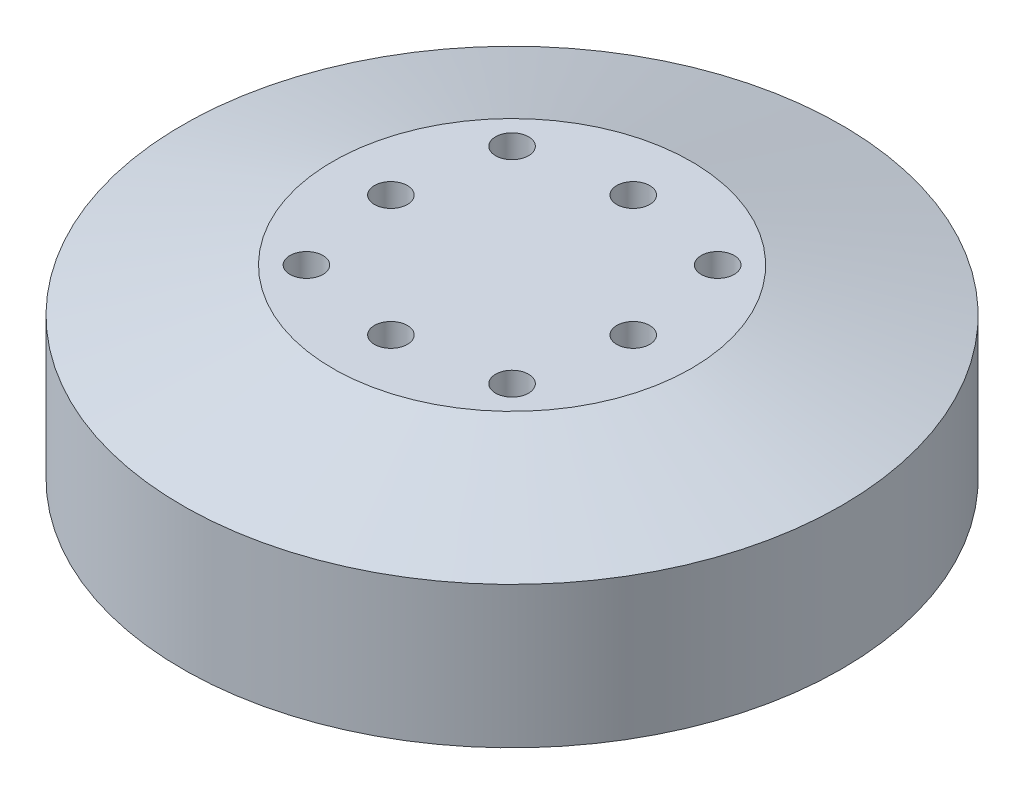
ISO-10303-21;
HEADER;
FILE_DESCRIPTION(('STEP AP214'),'2;1');
FILE_NAME('part.step','',(''),(''),'','','');
FILE_SCHEMA(('AUTOMOTIVE_DESIGN { 1 0 10303 214 1 1 1 1 }'));
ENDSEC;
DATA;
#1=APPLICATION_CONTEXT('core data for automotive mechanical design processes');
#2=APPLICATION_PROTOCOL_DEFINITION('international standard','automotive_design',2000,#1);
#3=PRODUCT_CONTEXT('',#1,'mechanical');
#4=PRODUCT('Part','Part','',(#3));
#5=PRODUCT_RELATED_PRODUCT_CATEGORY('part','',(#4));
#6=PRODUCT_DEFINITION_FORMATION('','',#4);
#7=PRODUCT_DEFINITION_CONTEXT('part definition',#1,'design');
#8=PRODUCT_DEFINITION('design','',#6,#7);
#9=PRODUCT_DEFINITION_SHAPE('','',#8);
#10=(LENGTH_UNIT() NAMED_UNIT(*) SI_UNIT(.MILLI.,.METRE.));
#11=(NAMED_UNIT(*) PLANE_ANGLE_UNIT() SI_UNIT($,.RADIAN.));
#12=(NAMED_UNIT(*) SI_UNIT($,.STERADIAN.) SOLID_ANGLE_UNIT());
#13=UNCERTAINTY_MEASURE_WITH_UNIT(LENGTH_MEASURE(1.E-05),#10,'distance_accuracy_value','');
#14=(GEOMETRIC_REPRESENTATION_CONTEXT(3) GLOBAL_UNCERTAINTY_ASSIGNED_CONTEXT((#13)) GLOBAL_UNIT_ASSIGNED_CONTEXT((#10,
#11,#12)) REPRESENTATION_CONTEXT('',''));
#15=CARTESIAN_POINT('',(0.,0.,0.));
#16=DIRECTION('',(0.,0.,1.));
#17=DIRECTION('',(1.,0.,0.));
#18=AXIS2_PLACEMENT_3D('',#15,#16,#17);
#19=CARTESIAN_POINT('',(0.,-9.55000000000001,0.));
#20=DIRECTION('',(0.,-1.,0.));
#21=DIRECTION('',(1.,0.,0.));
#22=AXIS2_PLACEMENT_3D('',#19,#20,#21);
#23=CYLINDRICAL_SURFACE('',#22,34.);
#24=CARTESIAN_POINT('',(0.,-9.55,0.));
#25=DIRECTION('',(0.,-1.,0.));
#26=DIRECTION('',(1.,0.,0.));
#27=AXIS2_PLACEMENT_3D('',#24,#25,#26);
#28=CIRCLE('',#27,34.);
#29=CARTESIAN_POINT('',(34.,-9.54999999999999,0.));
#30=VERTEX_POINT('',#29);
#31=EDGE_CURVE('E11',#30,#30,#28,.T.);
#32=ORIENTED_EDGE('',*,*,#31,.F.);
#33=EDGE_LOOP('',(#32));
#34=FACE_BOUND('',#33,.T.);
#35=CARTESIAN_POINT('',(0.,5.05000000000001,0.));
#36=DIRECTION('',(0.,-1.,0.));
#37=DIRECTION('',(1.,0.,0.));
#38=AXIS2_PLACEMENT_3D('',#35,#36,#37);
#39=CIRCLE('',#38,34.);
#40=CARTESIAN_POINT('',(34.,5.05000000000001,0.));
#41=VERTEX_POINT('',#40);
#42=EDGE_CURVE('E126',#41,#41,#39,.T.);
#43=ORIENTED_EDGE('',*,*,#42,.T.);
#44=EDGE_LOOP('',(#43));
#45=FACE_BOUND('',#44,.T.);
#46=ADVANCED_FACE('F35',(#34,#45),#23,.T.);
#47=CARTESIAN_POINT('',(-34.,-9.55000000000001,0.));
#48=DIRECTION('',(0.,1.,0.));
#49=DIRECTION('',(-1.,0.,0.));
#50=AXIS2_PLACEMENT_3D('',#47,#48,#49);
#51=PLANE('',#50);
#52=CARTESIAN_POINT('',(0.,-9.55,0.));
#53=DIRECTION('',(0.,-1.,0.));
#54=DIRECTION('',(1.,0.,0.));
#55=AXIS2_PLACEMENT_3D('',#52,#53,#54);
#56=CIRCLE('',#55,32.);
#57=CARTESIAN_POINT('',(32.,-9.55,0.));
#58=VERTEX_POINT('',#57);
#59=EDGE_CURVE('E381',#58,#58,#56,.T.);
#60=ORIENTED_EDGE('',*,*,#59,.F.);
#61=EDGE_LOOP('',(#60));
#62=FACE_BOUND('',#61,.T.);
#63=ORIENTED_EDGE('',*,*,#31,.T.);
#64=EDGE_LOOP('',(#63));
#65=FACE_BOUND('',#64,.T.);
#66=ADVANCED_FACE('F135',(#62,#65),#51,.F.);
#67=CARTESIAN_POINT('',(0.,9.55,0.));
#68=DIRECTION('',(0.,-1.,0.));
#69=DIRECTION('',(1.,0.,0.));
#70=AXIS2_PLACEMENT_3D('',#67,#68,#69);
#71=PLANE('',#70);
#72=CARTESIAN_POINT('',(-10.6066017177983,9.55,-10.6066017177982));
#73=DIRECTION('',(0.,1.,0.));
#74=DIRECTION('',(0.,0.,1.));
#75=AXIS2_PLACEMENT_3D('',#72,#73,#74);
#76=CIRCLE('',#75,1.69999999999999);
#77=CARTESIAN_POINT('',(-10.6066017177983,9.55,-8.90660171779816));
#78=VERTEX_POINT('',#77);
#79=EDGE_CURVE('E78',#78,#78,#76,.T.);
#80=ORIENTED_EDGE('',*,*,#79,.F.);
#81=EDGE_LOOP('',(#80));
#82=FACE_BOUND('',#81,.T.);
#83=CARTESIAN_POINT('',(0.,9.55000000000001,-12.5));
#84=DIRECTION('',(0.,1.,0.));
#85=DIRECTION('',(0.,0.,1.));
#86=AXIS2_PLACEMENT_3D('',#83,#84,#85);
#87=CIRCLE('',#86,1.69999999999999);
#88=CARTESIAN_POINT('',(0.,9.55000000000001,-10.8));
#89=VERTEX_POINT('',#88);
#90=EDGE_CURVE('E77',#89,#89,#87,.T.);
#91=ORIENTED_EDGE('',*,*,#90,.F.);
#92=EDGE_LOOP('',(#91));
#93=FACE_BOUND('',#92,.T.);
#94=CARTESIAN_POINT('',(10.6066017177982,9.55000000000001,-10.6066017177982));
#95=DIRECTION('',(0.,1.,0.));
#96=DIRECTION('',(0.,0.,1.));
#97=AXIS2_PLACEMENT_3D('',#94,#95,#96);
#98=CIRCLE('',#97,1.69999999999999);
#99=CARTESIAN_POINT('',(10.6066017177982,9.55000000000001,-8.90660171779824));
#100=VERTEX_POINT('',#99);
#101=EDGE_CURVE('E90',#100,#100,#98,.T.);
#102=ORIENTED_EDGE('',*,*,#101,.F.);
#103=EDGE_LOOP('',(#102));
#104=FACE_BOUND('',#103,.T.);
#105=CARTESIAN_POINT('',(12.5,9.55000000000001,0.));
#106=DIRECTION('',(0.,1.,0.));
#107=DIRECTION('',(0.,0.,1.));
#108=AXIS2_PLACEMENT_3D('',#105,#106,#107);
#109=CIRCLE('',#108,1.69999999999999);
#110=CARTESIAN_POINT('',(12.5,9.55000000000001,1.69999999999999));
#111=VERTEX_POINT('',#110);
#112=EDGE_CURVE('E96',#111,#111,#109,.T.);
#113=ORIENTED_EDGE('',*,*,#112,.F.);
#114=EDGE_LOOP('',(#113));
#115=FACE_BOUND('',#114,.T.);
#116=CARTESIAN_POINT('',(10.6066017177983,9.55000000000001,10.6066017177982));
#117=DIRECTION('',(0.,1.,0.));
#118=DIRECTION('',(0.,0.,1.));
#119=AXIS2_PLACEMENT_3D('',#116,#117,#118);
#120=CIRCLE('',#119,1.69999999999999);
#121=CARTESIAN_POINT('',(10.6066017177983,9.55000000000001,12.3066017177981));
#122=VERTEX_POINT('',#121);
#123=EDGE_CURVE('E102',#122,#122,#120,.T.);
#124=ORIENTED_EDGE('',*,*,#123,.F.);
#125=EDGE_LOOP('',(#124));
#126=FACE_BOUND('',#125,.T.);
#127=CARTESIAN_POINT('',(-10.6066017177982,9.55,10.6066017177982));
#128=DIRECTION('',(0.,1.,0.));
#129=DIRECTION('',(0.,0.,1.));
#130=AXIS2_PLACEMENT_3D('',#127,#128,#129);
#131=CIRCLE('',#130,1.69999999999999);
#132=CARTESIAN_POINT('',(-10.6066017177982,9.55,12.3066017177982));
#133=VERTEX_POINT('',#132);
#134=EDGE_CURVE('E108',#133,#133,#131,.T.);
#135=ORIENTED_EDGE('',*,*,#134,.F.);
#136=EDGE_LOOP('',(#135));
#137=FACE_BOUND('',#136,.T.);
#138=CARTESIAN_POINT('',(-12.5,9.55,0.));
#139=DIRECTION('',(0.,1.,0.));
#140=DIRECTION('',(0.,0.,1.));
#141=AXIS2_PLACEMENT_3D('',#138,#139,#140);
#142=CIRCLE('',#141,1.69999999999999);
#143=CARTESIAN_POINT('',(-12.5,9.55,1.69999999999999));
#144=VERTEX_POINT('',#143);
#145=EDGE_CURVE('E114',#144,#144,#142,.T.);
#146=ORIENTED_EDGE('',*,*,#145,.F.);
#147=EDGE_LOOP('',(#146));
#148=FACE_BOUND('',#147,.T.);
#149=CARTESIAN_POINT('',(0.,9.55000000000001,12.5));
#150=DIRECTION('',(0.,1.,0.));
#151=DIRECTION('',(0.,0.,1.));
#152=AXIS2_PLACEMENT_3D('',#149,#150,#151);
#153=CIRCLE('',#152,1.69999999999999);
#154=CARTESIAN_POINT('',(0.,9.55000000000001,14.2));
#155=VERTEX_POINT('',#154);
#156=EDGE_CURVE('E120',#155,#155,#153,.T.);
#157=ORIENTED_EDGE('',*,*,#156,.F.);
#158=EDGE_LOOP('',(#157));
#159=FACE_BOUND('',#158,.T.);
#160=CARTESIAN_POINT('',(0.,9.55,0.));
#161=DIRECTION('',(0.,-1.,0.));
#162=DIRECTION('',(1.,0.,0.));
#163=AXIS2_PLACEMENT_3D('',#160,#161,#162);
#164=CIRCLE('',#163,18.5);
#165=CARTESIAN_POINT('',(18.5,9.55,0.));
#166=VERTEX_POINT('',#165);
#167=EDGE_CURVE('E42',#166,#166,#164,.T.);
#168=ORIENTED_EDGE('',*,*,#167,.F.);
#169=EDGE_LOOP('',(#168));
#170=FACE_BOUND('',#169,.T.);
#171=ADVANCED_FACE('F133',(#82,#93,#104,#115,#126,#137,#148,#159,#170),#71,.F.);
#172=CARTESIAN_POINT('',(0.,9.55,0.));
#173=DIRECTION('',(0.,-1.,0.));
#174=DIRECTION('',(1.,0.,0.));
#175=AXIS2_PLACEMENT_3D('',#172,#173,#174);
#176=CONICAL_SURFACE('',#175,18.5,1.28824137432531);
#177=ORIENTED_EDGE('',*,*,#42,.F.);
#178=EDGE_LOOP('',(#177));
#179=FACE_BOUND('',#178,.T.);
#180=ORIENTED_EDGE('',*,*,#167,.T.);
#181=EDGE_LOOP('',(#180));
#182=FACE_BOUND('',#181,.T.);
#183=ADVANCED_FACE('F131',(#179,#182),#176,.T.);
#184=CARTESIAN_POINT('',(0.,5.55,12.5));
#185=DIRECTION('',(0.,1.,0.));
#186=DIRECTION('',(0.,0.,1.));
#187=AXIS2_PLACEMENT_3D('',#184,#185,#186);
#188=CONICAL_SURFACE('',#187,1.69999999999999,1.02974425867665);
#189=CARTESIAN_POINT('',(0.,4.52853694765315,12.5));
#190=VERTEX_POINT('',#189);
#191=VERTEX_LOOP('',#190);
#192=FACE_BOUND('',#191,.T.);
#193=CARTESIAN_POINT('',(0.,5.55,12.5));
#194=DIRECTION('',(0.,1.,0.));
#195=DIRECTION('',(0.,0.,1.));
#196=AXIS2_PLACEMENT_3D('',#193,#194,#195);
#197=CIRCLE('',#196,1.69999999999999);
#198=CARTESIAN_POINT('',(0.,5.55,14.2));
#199=VERTEX_POINT('',#198);
#200=EDGE_CURVE('E123',#199,#199,#197,.T.);
#201=ORIENTED_EDGE('',*,*,#200,.T.);
#202=EDGE_LOOP('',(#201));
#203=FACE_BOUND('',#202,.T.);
#204=ADVANCED_FACE('F142',(#192,#203),#188,.F.);
#205=CARTESIAN_POINT('',(0.,9.55,12.5));
#206=DIRECTION('',(0.,1.,0.));
#207=DIRECTION('',(0.,0.,1.));
#208=AXIS2_PLACEMENT_3D('',#205,#206,#207);
#209=CYLINDRICAL_SURFACE('',#208,1.69999999999999);
#210=ORIENTED_EDGE('',*,*,#200,.F.);
#211=EDGE_LOOP('',(#210));
#212=FACE_BOUND('',#211,.T.);
#213=ORIENTED_EDGE('',*,*,#156,.T.);
#214=EDGE_LOOP('',(#213));
#215=FACE_BOUND('',#214,.T.);
#216=ADVANCED_FACE('F240',(#212,#215),#209,.F.);
#217=CARTESIAN_POINT('',(-12.5,5.55,0.));
#218=DIRECTION('',(0.,1.,0.));
#219=DIRECTION('',(0.,0.,1.));
#220=AXIS2_PLACEMENT_3D('',#217,#218,#219);
#221=CONICAL_SURFACE('',#220,1.69999999999999,1.02974425867665);
#222=CARTESIAN_POINT('',(-12.5,4.52853694765315,0.));
#223=VERTEX_POINT('',#222);
#224=VERTEX_LOOP('',#223);
#225=FACE_BOUND('',#224,.T.);
#226=CARTESIAN_POINT('',(-12.5,5.55,0.));
#227=DIRECTION('',(0.,1.,0.));
#228=DIRECTION('',(0.,0.,1.));
#229=AXIS2_PLACEMENT_3D('',#226,#227,#228);
#230=CIRCLE('',#229,1.69999999999999);
#231=CARTESIAN_POINT('',(-12.5,5.55,1.69999999999999));
#232=VERTEX_POINT('',#231);
#233=EDGE_CURVE('E117',#232,#232,#230,.T.);
#234=ORIENTED_EDGE('',*,*,#233,.T.);
#235=EDGE_LOOP('',(#234));
#236=FACE_BOUND('',#235,.T.);
#237=ADVANCED_FACE('F236',(#225,#236),#221,.F.);
#238=CARTESIAN_POINT('',(-12.5,9.55,0.));
#239=DIRECTION('',(0.,1.,0.));
#240=DIRECTION('',(0.,0.,1.));
#241=AXIS2_PLACEMENT_3D('',#238,#239,#240);
#242=CYLINDRICAL_SURFACE('',#241,1.69999999999999);
#243=ORIENTED_EDGE('',*,*,#233,.F.);
#244=EDGE_LOOP('',(#243));
#245=FACE_BOUND('',#244,.T.);
#246=ORIENTED_EDGE('',*,*,#145,.T.);
#247=EDGE_LOOP('',(#246));
#248=FACE_BOUND('',#247,.T.);
#249=ADVANCED_FACE('F232',(#245,#248),#242,.F.);
#250=CARTESIAN_POINT('',(-10.6066017177982,5.55,10.6066017177982));
#251=DIRECTION('',(0.,1.,0.));
#252=DIRECTION('',(0.,0.,1.));
#253=AXIS2_PLACEMENT_3D('',#250,#251,#252);
#254=CONICAL_SURFACE('',#253,1.69999999999999,1.02974425867665);
#255=CARTESIAN_POINT('',(-10.6066017177982,4.52853694765315,10.6066017177982));
#256=VERTEX_POINT('',#255);
#257=VERTEX_LOOP('',#256);
#258=FACE_BOUND('',#257,.T.);
#259=CARTESIAN_POINT('',(-10.6066017177982,5.55,10.6066017177982));
#260=DIRECTION('',(0.,1.,0.));
#261=DIRECTION('',(0.,0.,1.));
#262=AXIS2_PLACEMENT_3D('',#259,#260,#261);
#263=CIRCLE('',#262,1.69999999999999);
#264=CARTESIAN_POINT('',(-10.6066017177982,5.55,12.3066017177982));
#265=VERTEX_POINT('',#264);
#266=EDGE_CURVE('E111',#265,#265,#263,.T.);
#267=ORIENTED_EDGE('',*,*,#266,.T.);
#268=EDGE_LOOP('',(#267));
#269=FACE_BOUND('',#268,.T.);
#270=ADVANCED_FACE('F228',(#258,#269),#254,.F.);
#271=CARTESIAN_POINT('',(-10.6066017177982,9.55,10.6066017177982));
#272=DIRECTION('',(0.,1.,0.));
#273=DIRECTION('',(0.,0.,1.));
#274=AXIS2_PLACEMENT_3D('',#271,#272,#273);
#275=CYLINDRICAL_SURFACE('',#274,1.69999999999999);
#276=ORIENTED_EDGE('',*,*,#266,.F.);
#277=EDGE_LOOP('',(#276));
#278=FACE_BOUND('',#277,.T.);
#279=ORIENTED_EDGE('',*,*,#134,.T.);
#280=EDGE_LOOP('',(#279));
#281=FACE_BOUND('',#280,.T.);
#282=ADVANCED_FACE('F224',(#278,#281),#275,.F.);
#283=CARTESIAN_POINT('',(10.6066017177983,5.55,10.6066017177982));
#284=DIRECTION('',(0.,1.,0.));
#285=DIRECTION('',(0.,0.,1.));
#286=AXIS2_PLACEMENT_3D('',#283,#284,#285);
#287=CONICAL_SURFACE('',#286,1.69999999999999,1.02974425867665);
#288=CARTESIAN_POINT('',(10.6066017177983,4.52853694765315,10.6066017177982));
#289=VERTEX_POINT('',#288);
#290=VERTEX_LOOP('',#289);
#291=FACE_BOUND('',#290,.T.);
#292=CARTESIAN_POINT('',(10.6066017177983,5.55,10.6066017177982));
#293=DIRECTION('',(0.,1.,0.));
#294=DIRECTION('',(0.,0.,1.));
#295=AXIS2_PLACEMENT_3D('',#292,#293,#294);
#296=CIRCLE('',#295,1.69999999999999);
#297=CARTESIAN_POINT('',(10.6066017177983,5.55,12.3066017177981));
#298=VERTEX_POINT('',#297);
#299=EDGE_CURVE('E105',#298,#298,#296,.T.);
#300=ORIENTED_EDGE('',*,*,#299,.T.);
#301=EDGE_LOOP('',(#300));
#302=FACE_BOUND('',#301,.T.);
#303=ADVANCED_FACE('F220',(#291,#302),#287,.F.);
#304=CARTESIAN_POINT('',(10.6066017177983,9.55000000000001,10.6066017177982));
#305=DIRECTION('',(0.,1.,0.));
#306=DIRECTION('',(0.,0.,1.));
#307=AXIS2_PLACEMENT_3D('',#304,#305,#306);
#308=CYLINDRICAL_SURFACE('',#307,1.69999999999999);
#309=ORIENTED_EDGE('',*,*,#299,.F.);
#310=EDGE_LOOP('',(#309));
#311=FACE_BOUND('',#310,.T.);
#312=ORIENTED_EDGE('',*,*,#123,.T.);
#313=EDGE_LOOP('',(#312));
#314=FACE_BOUND('',#313,.T.);
#315=ADVANCED_FACE('F216',(#311,#314),#308,.F.);
#316=CARTESIAN_POINT('',(12.5,5.55,0.));
#317=DIRECTION('',(0.,1.,0.));
#318=DIRECTION('',(0.,0.,1.));
#319=AXIS2_PLACEMENT_3D('',#316,#317,#318);
#320=CONICAL_SURFACE('',#319,1.69999999999999,1.02974425867665);
#321=CARTESIAN_POINT('',(12.5,4.52853694765315,0.));
#322=VERTEX_POINT('',#321);
#323=VERTEX_LOOP('',#322);
#324=FACE_BOUND('',#323,.T.);
#325=CARTESIAN_POINT('',(12.5,5.55,0.));
#326=DIRECTION('',(0.,1.,0.));
#327=DIRECTION('',(0.,0.,1.));
#328=AXIS2_PLACEMENT_3D('',#325,#326,#327);
#329=CIRCLE('',#328,1.69999999999999);
#330=CARTESIAN_POINT('',(12.5,5.55,1.69999999999999));
#331=VERTEX_POINT('',#330);
#332=EDGE_CURVE('E99',#331,#331,#329,.T.);
#333=ORIENTED_EDGE('',*,*,#332,.T.);
#334=EDGE_LOOP('',(#333));
#335=FACE_BOUND('',#334,.T.);
#336=ADVANCED_FACE('F212',(#324,#335),#320,.F.);
#337=CARTESIAN_POINT('',(12.5,9.55000000000001,0.));
#338=DIRECTION('',(0.,1.,0.));
#339=DIRECTION('',(0.,0.,1.));
#340=AXIS2_PLACEMENT_3D('',#337,#338,#339);
#341=CYLINDRICAL_SURFACE('',#340,1.69999999999999);
#342=ORIENTED_EDGE('',*,*,#332,.F.);
#343=EDGE_LOOP('',(#342));
#344=FACE_BOUND('',#343,.T.);
#345=ORIENTED_EDGE('',*,*,#112,.T.);
#346=EDGE_LOOP('',(#345));
#347=FACE_BOUND('',#346,.T.);
#348=ADVANCED_FACE('F208',(#344,#347),#341,.F.);
#349=CARTESIAN_POINT('',(10.6066017177982,5.55,-10.6066017177982));
#350=DIRECTION('',(0.,1.,0.));
#351=DIRECTION('',(0.,0.,1.));
#352=AXIS2_PLACEMENT_3D('',#349,#350,#351);
#353=CONICAL_SURFACE('',#352,1.69999999999999,1.02974425867665);
#354=CARTESIAN_POINT('',(10.6066017177982,4.52853694765315,-10.6066017177982));
#355=VERTEX_POINT('',#354);
#356=VERTEX_LOOP('',#355);
#357=FACE_BOUND('',#356,.T.);
#358=CARTESIAN_POINT('',(10.6066017177982,5.55,-10.6066017177982));
#359=DIRECTION('',(0.,1.,0.));
#360=DIRECTION('',(0.,0.,1.));
#361=AXIS2_PLACEMENT_3D('',#358,#359,#360);
#362=CIRCLE('',#361,1.69999999999999);
#363=CARTESIAN_POINT('',(10.6066017177982,5.55,-8.90660171779824));
#364=VERTEX_POINT('',#363);
#365=EDGE_CURVE('E93',#364,#364,#362,.T.);
#366=ORIENTED_EDGE('',*,*,#365,.T.);
#367=EDGE_LOOP('',(#366));
#368=FACE_BOUND('',#367,.T.);
#369=ADVANCED_FACE('F204',(#357,#368),#353,.F.);
#370=CARTESIAN_POINT('',(10.6066017177982,9.55000000000001,-10.6066017177982));
#371=DIRECTION('',(0.,1.,0.));
#372=DIRECTION('',(0.,0.,1.));
#373=AXIS2_PLACEMENT_3D('',#370,#371,#372);
#374=CYLINDRICAL_SURFACE('',#373,1.69999999999999);
#375=ORIENTED_EDGE('',*,*,#365,.F.);
#376=EDGE_LOOP('',(#375));
#377=FACE_BOUND('',#376,.T.);
#378=ORIENTED_EDGE('',*,*,#101,.T.);
#379=EDGE_LOOP('',(#378));
#380=FACE_BOUND('',#379,.T.);
#381=ADVANCED_FACE('F200',(#377,#380),#374,.F.);
#382=CARTESIAN_POINT('',(0.,5.55,-12.5));
#383=DIRECTION('',(0.,1.,0.));
#384=DIRECTION('',(0.,0.,1.));
#385=AXIS2_PLACEMENT_3D('',#382,#383,#384);
#386=CONICAL_SURFACE('',#385,1.69999999999999,1.02974425867665);
#387=CARTESIAN_POINT('',(0.,4.52853694765315,-12.5));
#388=VERTEX_POINT('',#387);
#389=VERTEX_LOOP('',#388);
#390=FACE_BOUND('',#389,.T.);
#391=CARTESIAN_POINT('',(0.,5.55,-12.5));
#392=DIRECTION('',(0.,1.,0.));
#393=DIRECTION('',(0.,0.,1.));
#394=AXIS2_PLACEMENT_3D('',#391,#392,#393);
#395=CIRCLE('',#394,1.69999999999999);
#396=CARTESIAN_POINT('',(0.,5.55,-10.8));
#397=VERTEX_POINT('',#396);
#398=EDGE_CURVE('E81',#397,#397,#395,.T.);
#399=ORIENTED_EDGE('',*,*,#398,.T.);
#400=EDGE_LOOP('',(#399));
#401=FACE_BOUND('',#400,.T.);
#402=ADVANCED_FACE('F196',(#390,#401),#386,.F.);
#403=CARTESIAN_POINT('',(0.,9.55,-12.5));
#404=DIRECTION('',(0.,1.,0.));
#405=DIRECTION('',(0.,0.,1.));
#406=AXIS2_PLACEMENT_3D('',#403,#404,#405);
#407=CYLINDRICAL_SURFACE('',#406,1.69999999999999);
#408=ORIENTED_EDGE('',*,*,#398,.F.);
#409=EDGE_LOOP('',(#408));
#410=FACE_BOUND('',#409,.T.);
#411=ORIENTED_EDGE('',*,*,#90,.T.);
#412=EDGE_LOOP('',(#411));
#413=FACE_BOUND('',#412,.T.);
#414=ADVANCED_FACE('F71',(#410,#413),#407,.F.);
#415=CARTESIAN_POINT('',(-10.6066017177983,5.55,-10.6066017177982));
#416=DIRECTION('',(0.,1.,0.));
#417=DIRECTION('',(0.,0.,1.));
#418=AXIS2_PLACEMENT_3D('',#415,#416,#417);
#419=CONICAL_SURFACE('',#418,1.69999999999999,1.02974425867665);
#420=CARTESIAN_POINT('',(-10.6066017177983,4.52853694765315,-10.6066017177982));
#421=VERTEX_POINT('',#420);
#422=VERTEX_LOOP('',#421);
#423=FACE_BOUND('',#422,.T.);
#424=CARTESIAN_POINT('',(-10.6066017177983,5.55,-10.6066017177982));
#425=DIRECTION('',(0.,1.,0.));
#426=DIRECTION('',(0.,0.,1.));
#427=AXIS2_PLACEMENT_3D('',#424,#425,#426);
#428=CIRCLE('',#427,1.69999999999999);
#429=CARTESIAN_POINT('',(-10.6066017177983,5.55,-8.90660171779816));
#430=VERTEX_POINT('',#429);
#431=EDGE_CURVE('E75',#430,#430,#428,.T.);
#432=ORIENTED_EDGE('',*,*,#431,.T.);
#433=EDGE_LOOP('',(#432));
#434=FACE_BOUND('',#433,.T.);
#435=ADVANCED_FACE('F67',(#423,#434),#419,.F.);
#436=CARTESIAN_POINT('',(-10.6066017177983,9.55,-10.6066017177982));
#437=DIRECTION('',(0.,1.,0.));
#438=DIRECTION('',(0.,0.,1.));
#439=AXIS2_PLACEMENT_3D('',#436,#437,#438);
#440=CYLINDRICAL_SURFACE('',#439,1.69999999999999);
#441=ORIENTED_EDGE('',*,*,#431,.F.);
#442=EDGE_LOOP('',(#441));
#443=FACE_BOUND('',#442,.T.);
#444=ORIENTED_EDGE('',*,*,#79,.T.);
#445=EDGE_LOOP('',(#444));
#446=FACE_BOUND('',#445,.T.);
#447=ADVANCED_FACE('F70',(#443,#446),#440,.F.);
#448=CARTESIAN_POINT('',(0.,-8.55000000000001,0.));
#449=DIRECTION('',(0.,-1.,0.));
#450=DIRECTION('',(1.,0.,0.));
#451=AXIS2_PLACEMENT_3D('',#448,#449,#450);
#452=CYLINDRICAL_SURFACE('',#451,32.);
#453=CARTESIAN_POINT('',(0.,-8.55000000000001,0.));
#454=DIRECTION('',(0.,-1.,0.));
#455=DIRECTION('',(1.,0.,0.));
#456=AXIS2_PLACEMENT_3D('',#453,#454,#455);
#457=CIRCLE('',#456,32.);
#458=CARTESIAN_POINT('',(32.,-8.55,0.));
#459=VERTEX_POINT('',#458);
#460=EDGE_CURVE('E84',#459,#459,#457,.T.);
#461=ORIENTED_EDGE('',*,*,#460,.F.);
#462=EDGE_LOOP('',(#461));
#463=FACE_BOUND('',#462,.T.);
#464=ORIENTED_EDGE('',*,*,#59,.T.);
#465=EDGE_LOOP('',(#464));
#466=FACE_BOUND('',#465,.T.);
#467=ADVANCED_FACE('F172',(#463,#466),#452,.F.);
#468=CARTESIAN_POINT('',(0.,-8.55000000000001,0.));
#469=DIRECTION('',(0.,-1.,0.));
#470=DIRECTION('',(1.,0.,0.));
#471=AXIS2_PLACEMENT_3D('',#468,#469,#470);
#472=PLANE('',#471);
#473=ORIENTED_EDGE('',*,*,#460,.T.);
#474=EDGE_LOOP('',(#473));
#475=FACE_BOUND('',#474,.T.);
#476=ADVANCED_FACE('F177',(#475),#472,.T.);
#477=CLOSED_SHELL('',(#46,#66,#171,#183,#204,#216,#237,#249,#270,#282,#303,#315,#336,#348,#369,
#381,#402,#414,#435,#447,#467,#476));
#478=MANIFOLD_SOLID_BREP('B2',#477);
#479=ADVANCED_BREP_SHAPE_REPRESENTATION('',(#18,#478),#14);
#480=SHAPE_DEFINITION_REPRESENTATION(#9,#479);
ENDSEC;
END-ISO-10303-21;
